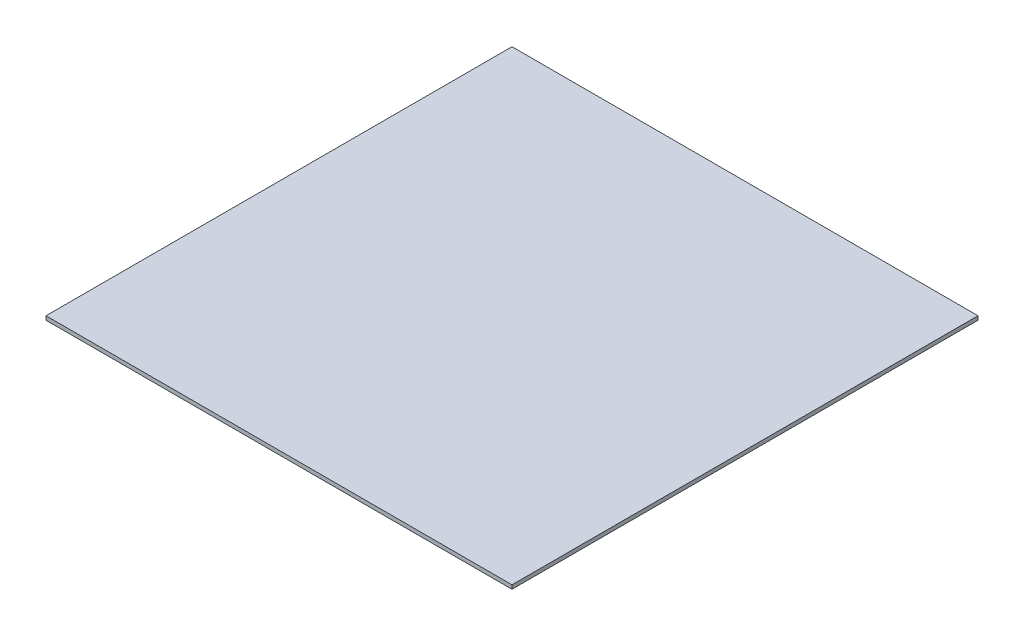
ISO-10303-21;
HEADER;
FILE_DESCRIPTION(('STEP AP214'),'2;1');
FILE_NAME('part.step','',(''),(''),'','','');
FILE_SCHEMA(('AUTOMOTIVE_DESIGN { 1 0 10303 214 1 1 1 1 }'));
ENDSEC;
DATA;
#1=APPLICATION_CONTEXT('core data for automotive mechanical design processes');
#2=APPLICATION_PROTOCOL_DEFINITION('international standard','automotive_design',2000,#1);
#3=PRODUCT_CONTEXT('',#1,'mechanical');
#4=PRODUCT('Part','Part','',(#3));
#5=PRODUCT_RELATED_PRODUCT_CATEGORY('part','',(#4));
#6=PRODUCT_DEFINITION_FORMATION('','',#4);
#7=PRODUCT_DEFINITION_CONTEXT('part definition',#1,'design');
#8=PRODUCT_DEFINITION('design','',#6,#7);
#9=PRODUCT_DEFINITION_SHAPE('','',#8);
#10=(LENGTH_UNIT() NAMED_UNIT(*) SI_UNIT(.MILLI.,.METRE.));
#11=(NAMED_UNIT(*) PLANE_ANGLE_UNIT() SI_UNIT($,.RADIAN.));
#12=(NAMED_UNIT(*) SI_UNIT($,.STERADIAN.) SOLID_ANGLE_UNIT());
#13=UNCERTAINTY_MEASURE_WITH_UNIT(LENGTH_MEASURE(1.E-05),#10,'distance_accuracy_value','');
#14=(GEOMETRIC_REPRESENTATION_CONTEXT(3) GLOBAL_UNCERTAINTY_ASSIGNED_CONTEXT((#13)) GLOBAL_UNIT_ASSIGNED_CONTEXT((#10,
#11,#12)) REPRESENTATION_CONTEXT('',''));
#15=CARTESIAN_POINT('',(0.,0.,0.));
#16=DIRECTION('',(0.,0.,1.));
#17=DIRECTION('',(1.,0.,0.));
#18=AXIS2_PLACEMENT_3D('',#15,#16,#17);
#19=CARTESIAN_POINT('',(60.,1.,-60.));
#20=DIRECTION('',(-1.,0.,0.));
#21=DIRECTION('',(0.,0.,1.));
#22=AXIS2_PLACEMENT_3D('',#19,#20,#21);
#23=PLANE('',#22);
#24=DIRECTION('',(0.,0.,-1.));
#25=VECTOR('',#24,1.);
#26=CARTESIAN_POINT('',(60.,0.,-60.));
#27=LINE('',#26,#25);
#28=CARTESIAN_POINT('',(60.,0.,60.));
#29=VERTEX_POINT('',#28);
#30=CARTESIAN_POINT('',(60.,0.,-60.));
#31=VERTEX_POINT('',#30);
#32=EDGE_CURVE('E96',#29,#31,#27,.T.);
#33=ORIENTED_EDGE('',*,*,#32,.T.);
#34=DIRECTION('',(0.,-1.,0.));
#35=VECTOR('',#34,1.);
#36=CARTESIAN_POINT('',(60.,1.,-60.));
#37=LINE('',#36,#35);
#38=CARTESIAN_POINT('',(60.,1.,-60.));
#39=VERTEX_POINT('',#38);
#40=EDGE_CURVE('E11',#39,#31,#37,.T.);
#41=ORIENTED_EDGE('',*,*,#40,.F.);
#42=DIRECTION('',(0.,0.,-1.));
#43=VECTOR('',#42,1.);
#44=CARTESIAN_POINT('',(60.,1.,-60.));
#45=LINE('',#44,#43);
#46=CARTESIAN_POINT('',(60.,1.,60.));
#47=VERTEX_POINT('',#46);
#48=EDGE_CURVE('E84',#47,#39,#45,.T.);
#49=ORIENTED_EDGE('',*,*,#48,.F.);
#50=DIRECTION('',(0.,-1.,0.));
#51=VECTOR('',#50,1.);
#52=CARTESIAN_POINT('',(60.,1.,60.));
#53=LINE('',#52,#51);
#54=EDGE_CURVE('E92',#47,#29,#53,.T.);
#55=ORIENTED_EDGE('',*,*,#54,.T.);
#56=EDGE_LOOP('',(#33,#41,#49,#55));
#57=FACE_BOUND('',#56,.T.);
#58=ADVANCED_FACE('F33',(#57),#23,.F.);
#59=CARTESIAN_POINT('',(-60.,1.,-60.));
#60=DIRECTION('',(0.,0.,1.));
#61=DIRECTION('',(1.,0.,0.));
#62=AXIS2_PLACEMENT_3D('',#59,#60,#61);
#63=PLANE('',#62);
#64=DIRECTION('',(-1.,0.,0.));
#65=VECTOR('',#64,1.);
#66=CARTESIAN_POINT('',(-60.,0.,-60.));
#67=LINE('',#66,#65);
#68=CARTESIAN_POINT('',(-60.,0.,-60.));
#69=VERTEX_POINT('',#68);
#70=EDGE_CURVE('E88',#31,#69,#67,.T.);
#71=ORIENTED_EDGE('',*,*,#70,.T.);
#72=DIRECTION('',(0.,-1.,0.));
#73=VECTOR('',#72,1.);
#74=CARTESIAN_POINT('',(-60.,1.,-60.));
#75=LINE('',#74,#73);
#76=CARTESIAN_POINT('',(-60.,1.,-60.));
#77=VERTEX_POINT('',#76);
#78=EDGE_CURVE('E41',#77,#69,#75,.T.);
#79=ORIENTED_EDGE('',*,*,#78,.F.);
#80=DIRECTION('',(-1.,0.,0.));
#81=VECTOR('',#80,1.);
#82=CARTESIAN_POINT('',(-60.,1.,-60.));
#83=LINE('',#82,#81);
#84=EDGE_CURVE('E79',#39,#77,#83,.T.);
#85=ORIENTED_EDGE('',*,*,#84,.F.);
#86=ORIENTED_EDGE('',*,*,#40,.T.);
#87=EDGE_LOOP('',(#71,#79,#85,#86));
#88=FACE_BOUND('',#87,.T.);
#89=ADVANCED_FACE('F87',(#88),#63,.F.);
#90=CARTESIAN_POINT('',(-60.,1.,-60.));
#91=DIRECTION('',(1.,0.,0.));
#92=DIRECTION('',(0.,0.,-1.));
#93=AXIS2_PLACEMENT_3D('',#90,#91,#92);
#94=PLANE('',#93);
#95=DIRECTION('',(0.,0.,1.));
#96=VECTOR('',#95,1.);
#97=CARTESIAN_POINT('',(-60.,0.,-60.));
#98=LINE('',#97,#96);
#99=CARTESIAN_POINT('',(-60.,0.,60.));
#100=VERTEX_POINT('',#99);
#101=EDGE_CURVE('E66',#69,#100,#98,.T.);
#102=ORIENTED_EDGE('',*,*,#101,.T.);
#103=DIRECTION('',(0.,-1.,0.));
#104=VECTOR('',#103,1.);
#105=CARTESIAN_POINT('',(-60.,1.,60.));
#106=LINE('',#105,#104);
#107=CARTESIAN_POINT('',(-60.,1.,60.));
#108=VERTEX_POINT('',#107);
#109=EDGE_CURVE('E89',#108,#100,#106,.T.);
#110=ORIENTED_EDGE('',*,*,#109,.F.);
#111=DIRECTION('',(0.,0.,1.));
#112=VECTOR('',#111,1.);
#113=CARTESIAN_POINT('',(-60.,1.,-60.));
#114=LINE('',#113,#112);
#115=EDGE_CURVE('E82',#77,#108,#114,.T.);
#116=ORIENTED_EDGE('',*,*,#115,.F.);
#117=ORIENTED_EDGE('',*,*,#78,.T.);
#118=EDGE_LOOP('',(#102,#110,#116,#117));
#119=FACE_BOUND('',#118,.T.);
#120=ADVANCED_FACE('F90',(#119),#94,.F.);
#121=CARTESIAN_POINT('',(-60.,1.,60.));
#122=DIRECTION('',(0.,0.,-1.));
#123=DIRECTION('',(-1.,0.,0.));
#124=AXIS2_PLACEMENT_3D('',#121,#122,#123);
#125=PLANE('',#124);
#126=DIRECTION('',(1.,0.,0.));
#127=VECTOR('',#126,1.);
#128=CARTESIAN_POINT('',(-60.,0.,60.));
#129=LINE('',#128,#127);
#130=EDGE_CURVE('E72',#100,#29,#129,.T.);
#131=ORIENTED_EDGE('',*,*,#130,.T.);
#132=ORIENTED_EDGE('',*,*,#54,.F.);
#133=DIRECTION('',(1.,0.,0.));
#134=VECTOR('',#133,1.);
#135=CARTESIAN_POINT('',(-60.,1.,60.));
#136=LINE('',#135,#134);
#137=EDGE_CURVE('E49',#108,#47,#136,.T.);
#138=ORIENTED_EDGE('',*,*,#137,.F.);
#139=ORIENTED_EDGE('',*,*,#109,.T.);
#140=EDGE_LOOP('',(#131,#132,#138,#139));
#141=FACE_BOUND('',#140,.T.);
#142=ADVANCED_FACE('F103',(#141),#125,.F.);
#143=CARTESIAN_POINT('',(0.,1.,0.));
#144=DIRECTION('',(0.,1.,0.));
#145=DIRECTION('',(0.,0.,1.));
#146=AXIS2_PLACEMENT_3D('',#143,#144,#145);
#147=PLANE('',#146);
#148=ORIENTED_EDGE('',*,*,#48,.T.);
#149=ORIENTED_EDGE('',*,*,#84,.T.);
#150=ORIENTED_EDGE('',*,*,#115,.T.);
#151=ORIENTED_EDGE('',*,*,#137,.T.);
#152=EDGE_LOOP('',(#148,#149,#150,#151));
#153=FACE_BOUND('',#152,.T.);
#154=ADVANCED_FACE('F80',(#153),#147,.T.);
#155=CARTESIAN_POINT('',(0.,0.,0.));
#156=DIRECTION('',(0.,1.,0.));
#157=DIRECTION('',(0.,0.,1.));
#158=AXIS2_PLACEMENT_3D('',#155,#156,#157);
#159=PLANE('',#158);
#160=ORIENTED_EDGE('',*,*,#32,.F.);
#161=ORIENTED_EDGE('',*,*,#130,.F.);
#162=ORIENTED_EDGE('',*,*,#101,.F.);
#163=ORIENTED_EDGE('',*,*,#70,.F.);
#164=EDGE_LOOP('',(#160,#161,#162,#163));
#165=FACE_BOUND('',#164,.T.);
#166=ADVANCED_FACE('F106',(#165),#159,.F.);
#167=CLOSED_SHELL('',(#58,#89,#120,#142,#154,#166));
#168=MANIFOLD_SOLID_BREP('B2',#167);
#169=ADVANCED_BREP_SHAPE_REPRESENTATION('',(#18,#168),#14);
#170=SHAPE_DEFINITION_REPRESENTATION(#9,#169);
ENDSEC;
END-ISO-10303-21;
